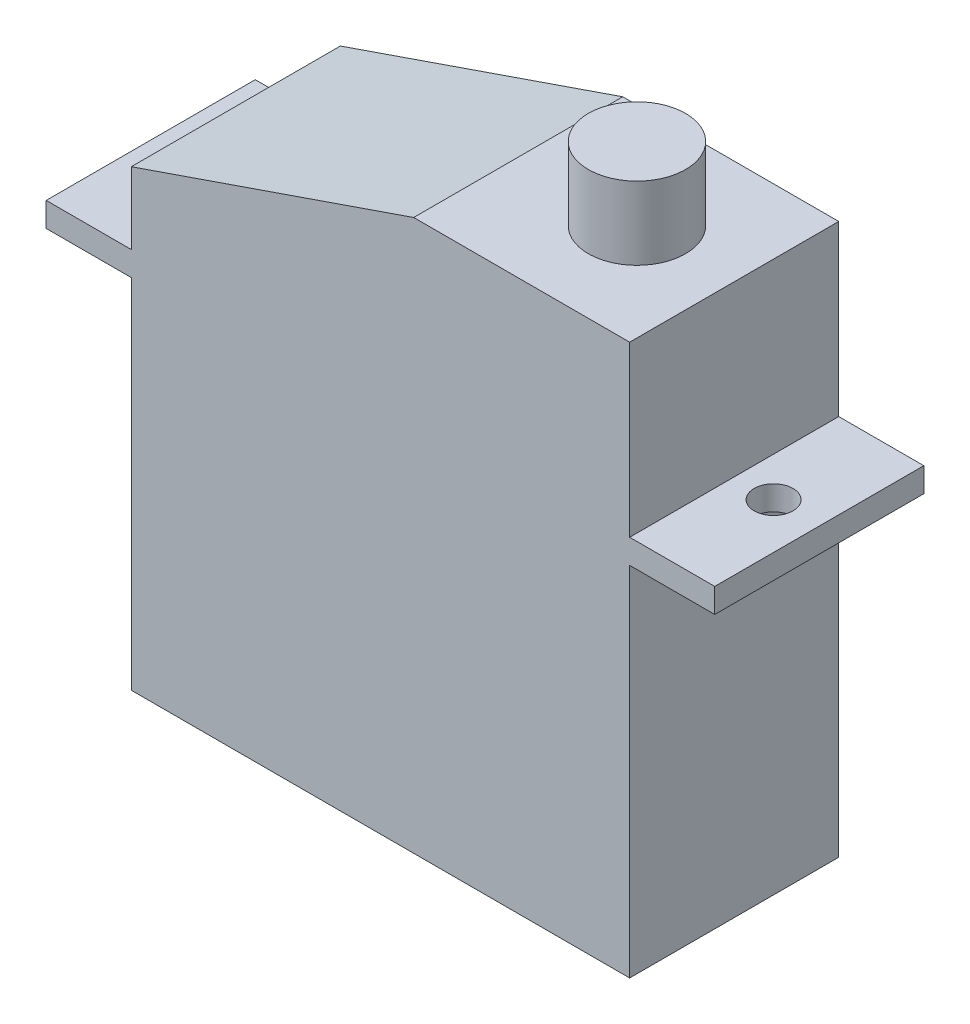
ISO-10303-21;
HEADER;
FILE_DESCRIPTION(('STEP AP214'),'2;1');
FILE_NAME('part.step','',(''),(''),'','','');
FILE_SCHEMA(('AUTOMOTIVE_DESIGN { 1 0 10303 214 1 1 1 1 }'));
ENDSEC;
DATA;
#1=APPLICATION_CONTEXT('core data for automotive mechanical design processes');
#2=APPLICATION_PROTOCOL_DEFINITION('international standard','automotive_design',2000,#1);
#3=PRODUCT_CONTEXT('',#1,'mechanical');
#4=PRODUCT('Part','Part','',(#3));
#5=PRODUCT_RELATED_PRODUCT_CATEGORY('part','',(#4));
#6=PRODUCT_DEFINITION_FORMATION('','',#4);
#7=PRODUCT_DEFINITION_CONTEXT('part definition',#1,'design');
#8=PRODUCT_DEFINITION('design','',#6,#7);
#9=PRODUCT_DEFINITION_SHAPE('','',#8);
#10=(LENGTH_UNIT() NAMED_UNIT(*) SI_UNIT(.MILLI.,.METRE.));
#11=(NAMED_UNIT(*) PLANE_ANGLE_UNIT() SI_UNIT($,.RADIAN.));
#12=(NAMED_UNIT(*) SI_UNIT($,.STERADIAN.) SOLID_ANGLE_UNIT());
#13=UNCERTAINTY_MEASURE_WITH_UNIT(LENGTH_MEASURE(1.E-05),#10,'distance_accuracy_value','');
#14=(GEOMETRIC_REPRESENTATION_CONTEXT(3) GLOBAL_UNCERTAINTY_ASSIGNED_CONTEXT((#13)) GLOBAL_UNIT_ASSIGNED_CONTEXT((#10,
#11,#12)) REPRESENTATION_CONTEXT('',''));
#15=CARTESIAN_POINT('',(0.,0.,0.));
#16=DIRECTION('',(0.,0.,1.));
#17=DIRECTION('',(1.,0.,0.));
#18=AXIS2_PLACEMENT_3D('',#15,#16,#17);
#19=CARTESIAN_POINT('',(20.5,15.2,0.));
#20=DIRECTION('',(-1.,0.,0.));
#21=DIRECTION('',(0.,0.,1.));
#22=AXIS2_PLACEMENT_3D('',#19,#20,#21);
#23=PLANE('',#22);
#24=DIRECTION('',(0.,0.,1.));
#25=VECTOR('',#24,1.);
#26=CARTESIAN_POINT('',(20.5,15.7,-8.6));
#27=LINE('',#26,#25);
#28=CARTESIAN_POINT('',(20.5,15.7,-8.6));
#29=VERTEX_POINT('',#28);
#30=CARTESIAN_POINT('',(20.5,15.7,0.));
#31=VERTEX_POINT('',#30);
#32=EDGE_CURVE('E249',#29,#31,#27,.T.);
#33=ORIENTED_EDGE('',*,*,#32,.F.);
#34=DIRECTION('',(0.,-1.,0.));
#35=VECTOR('',#34,1.);
#36=CARTESIAN_POINT('',(20.5,15.2,-8.6));
#37=LINE('',#36,#35);
#38=CARTESIAN_POINT('',(20.5,22.65,-8.6));
#39=VERTEX_POINT('',#38);
#40=EDGE_CURVE('E159',#39,#29,#37,.T.);
#41=ORIENTED_EDGE('',*,*,#40,.F.);
#42=DIRECTION('',(0.,0.,1.));
#43=VECTOR('',#42,1.);
#44=CARTESIAN_POINT('',(20.5,22.65,-8.6));
#45=LINE('',#44,#43);
#46=CARTESIAN_POINT('',(20.5,22.65,0.));
#47=VERTEX_POINT('',#46);
#48=EDGE_CURVE('E196',#39,#47,#45,.T.);
#49=ORIENTED_EDGE('',*,*,#48,.T.);
#50=DIRECTION('',(0.,-1.,0.));
#51=VECTOR('',#50,1.);
#52=CARTESIAN_POINT('',(20.5,15.2,0.));
#53=LINE('',#52,#51);
#54=EDGE_CURVE('E169',#47,#31,#53,.T.);
#55=ORIENTED_EDGE('',*,*,#54,.T.);
#56=EDGE_LOOP('',(#33,#41,#49,#55));
#57=FACE_BOUND('',#56,.T.);
#58=ADVANCED_FACE('F37',(#57),#23,.F.);
#59=CARTESIAN_POINT('',(0.,15.2,0.));
#60=DIRECTION('',(1.,0.,0.));
#61=DIRECTION('',(0.,0.,-1.));
#62=AXIS2_PLACEMENT_3D('',#59,#60,#61);
#63=PLANE('',#62);
#64=DIRECTION('',(0.,0.,1.));
#65=VECTOR('',#64,1.);
#66=CARTESIAN_POINT('',(0.,14.7,-8.6));
#67=LINE('',#66,#65);
#68=CARTESIAN_POINT('',(0.,14.7,-8.6));
#69=VERTEX_POINT('',#68);
#70=CARTESIAN_POINT('',(0.,14.7,0.));
#71=VERTEX_POINT('',#70);
#72=EDGE_CURVE('E216',#69,#71,#67,.T.);
#73=ORIENTED_EDGE('',*,*,#72,.F.);
#74=DIRECTION('',(0.,-1.,0.));
#75=VECTOR('',#74,1.);
#76=CARTESIAN_POINT('',(0.,15.2,-8.6));
#77=LINE('',#76,#75);
#78=CARTESIAN_POINT('',(0.,0.,-8.6));
#79=VERTEX_POINT('',#78);
#80=EDGE_CURVE('E165',#69,#79,#77,.T.);
#81=ORIENTED_EDGE('',*,*,#80,.T.);
#82=DIRECTION('',(0.,0.,1.));
#83=VECTOR('',#82,1.);
#84=CARTESIAN_POINT('',(0.,0.,0.));
#85=LINE('',#84,#83);
#86=CARTESIAN_POINT('',(0.,0.,0.));
#87=VERTEX_POINT('',#86);
#88=EDGE_CURVE('E218',#79,#87,#85,.T.);
#89=ORIENTED_EDGE('',*,*,#88,.T.);
#90=DIRECTION('',(0.,-1.,0.));
#91=VECTOR('',#90,1.);
#92=CARTESIAN_POINT('',(0.,15.2,0.));
#93=LINE('',#92,#91);
#94=EDGE_CURVE('E172',#71,#87,#93,.T.);
#95=ORIENTED_EDGE('',*,*,#94,.F.);
#96=EDGE_LOOP('',(#73,#81,#89,#95));
#97=FACE_BOUND('',#96,.T.);
#98=ADVANCED_FACE('F229',(#97),#63,.F.);
#99=CARTESIAN_POINT('',(0.,18.65,-8.6));
#100=VERTEX_POINT('',#99);
#101=CARTESIAN_POINT('',(0.,15.7,-8.6));
#102=VERTEX_POINT('',#101);
#103=EDGE_CURVE('E160',#100,#102,#77,.T.);
#104=ORIENTED_EDGE('',*,*,#103,.T.);
#105=DIRECTION('',(0.,0.,1.));
#106=VECTOR('',#105,1.);
#107=CARTESIAN_POINT('',(0.,15.7,-8.6));
#108=LINE('',#107,#106);
#109=CARTESIAN_POINT('',(0.,15.7,0.));
#110=VERTEX_POINT('',#109);
#111=EDGE_CURVE('E204',#102,#110,#108,.T.);
#112=ORIENTED_EDGE('',*,*,#111,.T.);
#113=CARTESIAN_POINT('',(0.,18.65,0.));
#114=VERTEX_POINT('',#113);
#115=EDGE_CURVE('E173',#114,#110,#93,.T.);
#116=ORIENTED_EDGE('',*,*,#115,.F.);
#117=DIRECTION('',(0.,0.,-1.));
#118=VECTOR('',#117,1.);
#119=CARTESIAN_POINT('',(0.,18.65,-8.6));
#120=LINE('',#119,#118);
#121=EDGE_CURVE('E181',#114,#100,#120,.T.);
#122=ORIENTED_EDGE('',*,*,#121,.T.);
#123=EDGE_LOOP('',(#104,#112,#116,#122));
#124=FACE_BOUND('',#123,.T.);
#125=ADVANCED_FACE('F203',(#124),#63,.F.);
#126=CARTESIAN_POINT('',(0.,15.2,0.));
#127=DIRECTION('',(0.,0.,-1.));
#128=DIRECTION('',(-1.,0.,0.));
#129=AXIS2_PLACEMENT_3D('',#126,#127,#128);
#130=PLANE('',#129);
#131=DIRECTION('',(-1.,0.,0.));
#132=VECTOR('',#131,1.);
#133=CARTESIAN_POINT('',(20.5,22.65,0.));
#134=LINE('',#133,#132);
#135=CARTESIAN_POINT('',(11.6168435107033,22.65,0.));
#136=VERTEX_POINT('',#135);
#137=EDGE_CURVE('E197',#47,#136,#134,.T.);
#138=ORIENTED_EDGE('',*,*,#137,.T.);
#139=DIRECTION('',(-0.945518575599317,-0.325568154457158,0.));
#140=VECTOR('',#139,1.);
#141=CARTESIAN_POINT('',(11.6168435107033,22.65,0.));
#142=LINE('',#141,#140);
#143=EDGE_CURVE('E179',#136,#114,#142,.T.);
#144=ORIENTED_EDGE('',*,*,#143,.T.);
#145=ORIENTED_EDGE('',*,*,#115,.T.);
#146=DIRECTION('',(-1.,0.,0.));
#147=VECTOR('',#146,1.);
#148=CARTESIAN_POINT('',(0.,15.7,0.));
#149=LINE('',#148,#147);
#150=CARTESIAN_POINT('',(-3.5,15.7,0.));
#151=VERTEX_POINT('',#150);
#152=EDGE_CURVE('E63',#110,#151,#149,.T.);
#153=ORIENTED_EDGE('',*,*,#152,.T.);
#154=DIRECTION('',(0.,-1.,0.));
#155=VECTOR('',#154,1.);
#156=CARTESIAN_POINT('',(-3.5,15.7,0.));
#157=LINE('',#156,#155);
#158=CARTESIAN_POINT('',(-3.5,14.7,0.));
#159=VERTEX_POINT('',#158);
#160=EDGE_CURVE('E248',#151,#159,#157,.T.);
#161=ORIENTED_EDGE('',*,*,#160,.T.);
#162=DIRECTION('',(1.,0.,0.));
#163=VECTOR('',#162,1.);
#164=CARTESIAN_POINT('',(0.,14.7,0.));
#165=LINE('',#164,#163);
#166=EDGE_CURVE('E238',#159,#71,#165,.T.);
#167=ORIENTED_EDGE('',*,*,#166,.T.);
#168=ORIENTED_EDGE('',*,*,#94,.T.);
#169=DIRECTION('',(1.,0.,0.));
#170=VECTOR('',#169,1.);
#171=CARTESIAN_POINT('',(0.,0.,0.));
#172=LINE('',#171,#170);
#173=CARTESIAN_POINT('',(20.5,0.,0.));
#174=VERTEX_POINT('',#173);
#175=EDGE_CURVE('E221',#87,#174,#172,.T.);
#176=ORIENTED_EDGE('',*,*,#175,.T.);
#177=CARTESIAN_POINT('',(20.5,14.7,0.));
#178=VERTEX_POINT('',#177);
#179=EDGE_CURVE('E163',#178,#174,#53,.T.);
#180=ORIENTED_EDGE('',*,*,#179,.F.);
#181=DIRECTION('',(1.,0.,0.));
#182=VECTOR('',#181,1.);
#183=CARTESIAN_POINT('',(20.5,14.7,0.));
#184=LINE('',#183,#182);
#185=CARTESIAN_POINT('',(24.,14.7,0.));
#186=VERTEX_POINT('',#185);
#187=EDGE_CURVE('E55',#178,#186,#184,.T.);
#188=ORIENTED_EDGE('',*,*,#187,.T.);
#189=DIRECTION('',(0.,1.,0.));
#190=VECTOR('',#189,1.);
#191=CARTESIAN_POINT('',(24.,15.7,0.));
#192=LINE('',#191,#190);
#193=CARTESIAN_POINT('',(24.,15.7,0.));
#194=VERTEX_POINT('',#193);
#195=EDGE_CURVE('E417',#186,#194,#192,.T.);
#196=ORIENTED_EDGE('',*,*,#195,.T.);
#197=DIRECTION('',(-1.,0.,0.));
#198=VECTOR('',#197,1.);
#199=CARTESIAN_POINT('',(20.5,15.7,0.));
#200=LINE('',#199,#198);
#201=EDGE_CURVE('E153',#194,#31,#200,.T.);
#202=ORIENTED_EDGE('',*,*,#201,.T.);
#203=ORIENTED_EDGE('',*,*,#54,.F.);
#204=EDGE_LOOP('',(#138,#144,#145,#153,#161,#167,#168,#176,#180,#188,#196,#202,#203));
#205=FACE_BOUND('',#204,.T.);
#206=ADVANCED_FACE('F201',(#205),#130,.F.);
#207=CARTESIAN_POINT('',(20.5,14.7,-8.6));
#208=VERTEX_POINT('',#207);
#209=CARTESIAN_POINT('',(20.5,0.,-8.6));
#210=VERTEX_POINT('',#209);
#211=EDGE_CURVE('E148',#208,#210,#37,.T.);
#212=ORIENTED_EDGE('',*,*,#211,.F.);
#213=DIRECTION('',(0.,0.,1.));
#214=VECTOR('',#213,1.);
#215=CARTESIAN_POINT('',(20.5,14.7,-8.6));
#216=LINE('',#215,#214);
#217=EDGE_CURVE('E133',#208,#178,#216,.T.);
#218=ORIENTED_EDGE('',*,*,#217,.T.);
#219=ORIENTED_EDGE('',*,*,#179,.T.);
#220=DIRECTION('',(0.,0.,-1.));
#221=VECTOR('',#220,1.);
#222=CARTESIAN_POINT('',(20.5,0.,0.));
#223=LINE('',#222,#221);
#224=EDGE_CURVE('E157',#174,#210,#223,.T.);
#225=ORIENTED_EDGE('',*,*,#224,.T.);
#226=EDGE_LOOP('',(#212,#218,#219,#225));
#227=FACE_BOUND('',#226,.T.);
#228=ADVANCED_FACE('F155',(#227),#23,.F.);
#229=CARTESIAN_POINT('',(0.,15.2,-8.6));
#230=DIRECTION('',(0.,0.,1.));
#231=DIRECTION('',(1.,0.,0.));
#232=AXIS2_PLACEMENT_3D('',#229,#230,#231);
#233=PLANE('',#232);
#234=ORIENTED_EDGE('',*,*,#103,.F.);
#235=DIRECTION('',(0.945518575599317,0.325568154457158,0.));
#236=VECTOR('',#235,1.);
#237=CARTESIAN_POINT('',(11.6168435107033,22.65,-8.6));
#238=LINE('',#237,#236);
#239=CARTESIAN_POINT('',(11.6168435107033,22.65,-8.6));
#240=VERTEX_POINT('',#239);
#241=EDGE_CURVE('E47',#100,#240,#238,.T.);
#242=ORIENTED_EDGE('',*,*,#241,.T.);
#243=DIRECTION('',(-1.,0.,0.));
#244=VECTOR('',#243,1.);
#245=CARTESIAN_POINT('',(20.5,22.65,-8.6));
#246=LINE('',#245,#244);
#247=EDGE_CURVE('E185',#39,#240,#246,.T.);
#248=ORIENTED_EDGE('',*,*,#247,.F.);
#249=ORIENTED_EDGE('',*,*,#40,.T.);
#250=DIRECTION('',(-1.,0.,0.));
#251=VECTOR('',#250,1.);
#252=CARTESIAN_POINT('',(20.5,15.7,-8.6));
#253=LINE('',#252,#251);
#254=CARTESIAN_POINT('',(24.,15.7,-8.6));
#255=VERTEX_POINT('',#254);
#256=EDGE_CURVE('E141',#255,#29,#253,.T.);
#257=ORIENTED_EDGE('',*,*,#256,.F.);
#258=DIRECTION('',(0.,1.,0.));
#259=VECTOR('',#258,1.);
#260=CARTESIAN_POINT('',(24.,15.7,-8.6));
#261=LINE('',#260,#259);
#262=CARTESIAN_POINT('',(24.,14.7,-8.6));
#263=VERTEX_POINT('',#262);
#264=EDGE_CURVE('E152',#263,#255,#261,.T.);
#265=ORIENTED_EDGE('',*,*,#264,.F.);
#266=DIRECTION('',(1.,0.,0.));
#267=VECTOR('',#266,1.);
#268=CARTESIAN_POINT('',(20.5,14.7,-8.6));
#269=LINE('',#268,#267);
#270=EDGE_CURVE('E136',#208,#263,#269,.T.);
#271=ORIENTED_EDGE('',*,*,#270,.F.);
#272=ORIENTED_EDGE('',*,*,#211,.T.);
#273=DIRECTION('',(-1.,0.,0.));
#274=VECTOR('',#273,1.);
#275=CARTESIAN_POINT('',(0.,0.,-8.6));
#276=LINE('',#275,#274);
#277=EDGE_CURVE('E224',#210,#79,#276,.T.);
#278=ORIENTED_EDGE('',*,*,#277,.T.);
#279=ORIENTED_EDGE('',*,*,#80,.F.);
#280=DIRECTION('',(1.,0.,0.));
#281=VECTOR('',#280,1.);
#282=CARTESIAN_POINT('',(0.,14.7,-8.6));
#283=LINE('',#282,#281);
#284=CARTESIAN_POINT('',(-3.5,14.7,-8.6));
#285=VERTEX_POINT('',#284);
#286=EDGE_CURVE('E207',#285,#69,#283,.T.);
#287=ORIENTED_EDGE('',*,*,#286,.F.);
#288=DIRECTION('',(0.,-1.,0.));
#289=VECTOR('',#288,1.);
#290=CARTESIAN_POINT('',(-3.5,15.7,-8.6));
#291=LINE('',#290,#289);
#292=CARTESIAN_POINT('',(-3.5,15.7,-8.6));
#293=VERTEX_POINT('',#292);
#294=EDGE_CURVE('E211',#293,#285,#291,.T.);
#295=ORIENTED_EDGE('',*,*,#294,.F.);
#296=DIRECTION('',(-1.,0.,0.));
#297=VECTOR('',#296,1.);
#298=CARTESIAN_POINT('',(0.,15.7,-8.6));
#299=LINE('',#298,#297);
#300=EDGE_CURVE('E243',#102,#293,#299,.T.);
#301=ORIENTED_EDGE('',*,*,#300,.F.);
#302=EDGE_LOOP('',(#234,#242,#248,#249,#257,#265,#271,#272,#278,#279,#287,#295,#301));
#303=FACE_BOUND('',#302,.T.);
#304=ADVANCED_FACE('F146',(#303),#233,.F.);
#305=CARTESIAN_POINT('',(0.,0.,0.));
#306=DIRECTION('',(0.,-1.,0.));
#307=DIRECTION('',(0.,0.,-1.));
#308=AXIS2_PLACEMENT_3D('',#305,#306,#307);
#309=PLANE('',#308);
#310=ORIENTED_EDGE('',*,*,#88,.F.);
#311=ORIENTED_EDGE('',*,*,#277,.F.);
#312=ORIENTED_EDGE('',*,*,#224,.F.);
#313=ORIENTED_EDGE('',*,*,#175,.F.);
#314=EDGE_LOOP('',(#310,#311,#312,#313));
#315=FACE_BOUND('',#314,.T.);
#316=ADVANCED_FACE('F254',(#315),#309,.T.);
#317=CARTESIAN_POINT('',(20.5,22.65,-8.6));
#318=DIRECTION('',(0.,1.,0.));
#319=DIRECTION('',(-1.,0.,0.));
#320=AXIS2_PLACEMENT_3D('',#317,#318,#319);
#321=PLANE('',#320);
#322=CARTESIAN_POINT('',(16.5,22.65,-4.3));
#323=DIRECTION('',(0.,1.,0.));
#324=DIRECTION('',(-1.,0.,0.));
#325=AXIS2_PLACEMENT_3D('',#322,#323,#324);
#326=CIRCLE('',#325,2.);
#327=CARTESIAN_POINT('',(14.5,22.65,-4.3));
#328=VERTEX_POINT('',#327);
#329=EDGE_CURVE('E11',#328,#328,#326,.T.);
#330=ORIENTED_EDGE('',*,*,#329,.F.);
#331=EDGE_LOOP('',(#330));
#332=FACE_BOUND('',#331,.T.);
#333=ORIENTED_EDGE('',*,*,#247,.T.);
#334=DIRECTION('',(0.,0.,1.));
#335=VECTOR('',#334,1.);
#336=CARTESIAN_POINT('',(11.6168435107033,22.65,0.));
#337=LINE('',#336,#335);
#338=EDGE_CURVE('E176',#240,#136,#337,.T.);
#339=ORIENTED_EDGE('',*,*,#338,.T.);
#340=ORIENTED_EDGE('',*,*,#137,.F.);
#341=ORIENTED_EDGE('',*,*,#48,.F.);
#342=EDGE_LOOP('',(#333,#339,#340,#341));
#343=FACE_BOUND('',#342,.T.);
#344=ADVANCED_FACE('F192',(#332,#343),#321,.T.);
#345=CARTESIAN_POINT('',(11.6168435107033,22.65,-8.6));
#346=DIRECTION('',(-0.325568154457157,0.945518575599316,0.));
#347=DIRECTION('',(0.,0.,-1.));
#348=AXIS2_PLACEMENT_3D('',#345,#346,#347);
#349=PLANE('',#348);
#350=ORIENTED_EDGE('',*,*,#241,.F.);
#351=ORIENTED_EDGE('',*,*,#121,.F.);
#352=ORIENTED_EDGE('',*,*,#143,.F.);
#353=ORIENTED_EDGE('',*,*,#338,.F.);
#354=EDGE_LOOP('',(#350,#351,#352,#353));
#355=FACE_BOUND('',#354,.T.);
#356=ADVANCED_FACE('F40',(#355),#349,.T.);
#357=CARTESIAN_POINT('',(0.,14.7,-8.6));
#358=DIRECTION('',(0.,-1.,0.));
#359=DIRECTION('',(1.,0.,0.));
#360=AXIS2_PLACEMENT_3D('',#357,#358,#359);
#361=PLANE('',#360);
#362=CARTESIAN_POINT('',(-1.62,14.7,-4.3));
#363=DIRECTION('',(0.,-1.,0.));
#364=DIRECTION('',(1.,0.,0.));
#365=AXIS2_PLACEMENT_3D('',#362,#363,#364);
#366=CIRCLE('',#365,0.8);
#367=CARTESIAN_POINT('',(-2.42,14.7,-4.3));
#368=VERTEX_POINT('',#367);
#369=EDGE_CURVE('E411',#368,#368,#366,.T.);
#370=ORIENTED_EDGE('',*,*,#369,.F.);
#371=EDGE_LOOP('',(#370));
#372=FACE_BOUND('',#371,.T.);
#373=ORIENTED_EDGE('',*,*,#166,.F.);
#374=DIRECTION('',(0.,0.,1.));
#375=VECTOR('',#374,1.);
#376=CARTESIAN_POINT('',(-3.5,14.7,-8.6));
#377=LINE('',#376,#375);
#378=EDGE_CURVE('E209',#285,#159,#377,.T.);
#379=ORIENTED_EDGE('',*,*,#378,.F.);
#380=ORIENTED_EDGE('',*,*,#286,.T.);
#381=ORIENTED_EDGE('',*,*,#72,.T.);
#382=EDGE_LOOP('',(#373,#379,#380,#381));
#383=FACE_BOUND('',#382,.T.);
#384=ADVANCED_FACE('F236',(#372,#383),#361,.T.);
#385=CARTESIAN_POINT('',(-3.5,15.7,-8.6));
#386=DIRECTION('',(-1.,0.,0.));
#387=DIRECTION('',(0.,0.,1.));
#388=AXIS2_PLACEMENT_3D('',#385,#386,#387);
#389=PLANE('',#388);
#390=ORIENTED_EDGE('',*,*,#160,.F.);
#391=DIRECTION('',(0.,0.,1.));
#392=VECTOR('',#391,1.);
#393=CARTESIAN_POINT('',(-3.5,15.7,-8.6));
#394=LINE('',#393,#392);
#395=EDGE_CURVE('E206',#293,#151,#394,.T.);
#396=ORIENTED_EDGE('',*,*,#395,.F.);
#397=ORIENTED_EDGE('',*,*,#294,.T.);
#398=ORIENTED_EDGE('',*,*,#378,.T.);
#399=EDGE_LOOP('',(#390,#396,#397,#398));
#400=FACE_BOUND('',#399,.T.);
#401=ADVANCED_FACE('F242',(#400),#389,.T.);
#402=CARTESIAN_POINT('',(0.,15.7,-8.6));
#403=DIRECTION('',(0.,1.,0.));
#404=DIRECTION('',(-1.,0.,0.));
#405=AXIS2_PLACEMENT_3D('',#402,#403,#404);
#406=PLANE('',#405);
#407=CARTESIAN_POINT('',(-1.62,15.7,-4.3));
#408=DIRECTION('',(0.,1.,0.));
#409=DIRECTION('',(-1.,0.,0.));
#410=AXIS2_PLACEMENT_3D('',#407,#408,#409);
#411=CIRCLE('',#410,0.8);
#412=CARTESIAN_POINT('',(-2.42,15.7,-4.3));
#413=VERTEX_POINT('',#412);
#414=EDGE_CURVE('E406',#413,#413,#411,.T.);
#415=ORIENTED_EDGE('',*,*,#414,.F.);
#416=EDGE_LOOP('',(#415));
#417=FACE_BOUND('',#416,.T.);
#418=ORIENTED_EDGE('',*,*,#152,.F.);
#419=ORIENTED_EDGE('',*,*,#111,.F.);
#420=ORIENTED_EDGE('',*,*,#300,.T.);
#421=ORIENTED_EDGE('',*,*,#395,.T.);
#422=EDGE_LOOP('',(#418,#419,#420,#421));
#423=FACE_BOUND('',#422,.T.);
#424=ADVANCED_FACE('F324',(#417,#423),#406,.T.);
#425=CARTESIAN_POINT('',(20.5,15.7,-8.6));
#426=DIRECTION('',(0.,1.,0.));
#427=DIRECTION('',(0.,0.,1.));
#428=AXIS2_PLACEMENT_3D('',#425,#426,#427);
#429=PLANE('',#428);
#430=CARTESIAN_POINT('',(22.12,15.7,-4.3));
#431=DIRECTION('',(0.,1.,0.));
#432=DIRECTION('',(-1.,0.,0.));
#433=AXIS2_PLACEMENT_3D('',#430,#431,#432);
#434=CIRCLE('',#433,0.799999999999999);
#435=CARTESIAN_POINT('',(21.32,15.7,-4.3));
#436=VERTEX_POINT('',#435);
#437=EDGE_CURVE('E403',#436,#436,#434,.T.);
#438=ORIENTED_EDGE('',*,*,#437,.F.);
#439=EDGE_LOOP('',(#438));
#440=FACE_BOUND('',#439,.T.);
#441=ORIENTED_EDGE('',*,*,#201,.F.);
#442=DIRECTION('',(0.,0.,1.));
#443=VECTOR('',#442,1.);
#444=CARTESIAN_POINT('',(24.,15.7,-8.6));
#445=LINE('',#444,#443);
#446=EDGE_CURVE('E423',#255,#194,#445,.T.);
#447=ORIENTED_EDGE('',*,*,#446,.F.);
#448=ORIENTED_EDGE('',*,*,#256,.T.);
#449=ORIENTED_EDGE('',*,*,#32,.T.);
#450=EDGE_LOOP('',(#441,#447,#448,#449));
#451=FACE_BOUND('',#450,.T.);
#452=ADVANCED_FACE('F333',(#440,#451),#429,.T.);
#453=CARTESIAN_POINT('',(24.,15.7,-8.6));
#454=DIRECTION('',(1.,0.,0.));
#455=DIRECTION('',(0.,0.,-1.));
#456=AXIS2_PLACEMENT_3D('',#453,#454,#455);
#457=PLANE('',#456);
#458=ORIENTED_EDGE('',*,*,#195,.F.);
#459=DIRECTION('',(0.,0.,1.));
#460=VECTOR('',#459,1.);
#461=CARTESIAN_POINT('',(24.,14.7,-8.6));
#462=LINE('',#461,#460);
#463=EDGE_CURVE('E140',#263,#186,#462,.T.);
#464=ORIENTED_EDGE('',*,*,#463,.F.);
#465=ORIENTED_EDGE('',*,*,#264,.T.);
#466=ORIENTED_EDGE('',*,*,#446,.T.);
#467=EDGE_LOOP('',(#458,#464,#465,#466));
#468=FACE_BOUND('',#467,.T.);
#469=ADVANCED_FACE('F342',(#468),#457,.T.);
#470=CARTESIAN_POINT('',(20.5,14.7,-8.6));
#471=DIRECTION('',(0.,-1.,0.));
#472=DIRECTION('',(1.,0.,0.));
#473=AXIS2_PLACEMENT_3D('',#470,#471,#472);
#474=PLANE('',#473);
#475=CARTESIAN_POINT('',(22.12,14.7,-4.3));
#476=DIRECTION('',(0.,-1.,0.));
#477=DIRECTION('',(1.,0.,0.));
#478=AXIS2_PLACEMENT_3D('',#475,#476,#477);
#479=CIRCLE('',#478,0.799999999999999);
#480=CARTESIAN_POINT('',(21.32,14.7,-4.3));
#481=VERTEX_POINT('',#480);
#482=EDGE_CURVE('E42',#481,#481,#479,.T.);
#483=ORIENTED_EDGE('',*,*,#482,.F.);
#484=EDGE_LOOP('',(#483));
#485=FACE_BOUND('',#484,.T.);
#486=ORIENTED_EDGE('',*,*,#187,.F.);
#487=ORIENTED_EDGE('',*,*,#217,.F.);
#488=ORIENTED_EDGE('',*,*,#270,.T.);
#489=ORIENTED_EDGE('',*,*,#463,.T.);
#490=EDGE_LOOP('',(#486,#487,#488,#489));
#491=FACE_BOUND('',#490,.T.);
#492=ADVANCED_FACE('F135',(#485,#491),#474,.T.);
#493=CARTESIAN_POINT('',(22.12,7.09999999999995,-4.3));
#494=DIRECTION('',(0.,1.,0.));
#495=DIRECTION('',(-1.,0.,0.));
#496=AXIS2_PLACEMENT_3D('',#493,#494,#495);
#497=CYLINDRICAL_SURFACE('',#496,0.799999999999999);
#498=CARTESIAN_POINT('',(21.32,14.7,-4.3));
#499=CARTESIAN_POINT('',(21.32,14.7104166666667,-4.3));
#500=CARTESIAN_POINT('',(21.32,14.7208333333333,-4.3));
#501=CARTESIAN_POINT('',(21.32,14.7416666666667,-4.3));
#502=CARTESIAN_POINT('',(21.32,14.7520833333333,-4.3));
#503=CARTESIAN_POINT('',(21.32,14.7729166666667,-4.3));
#504=CARTESIAN_POINT('',(21.32,14.7833333333333,-4.3));
#505=CARTESIAN_POINT('',(21.32,14.8041666666667,-4.3));
#506=CARTESIAN_POINT('',(21.32,14.8145833333333,-4.3));
#507=CARTESIAN_POINT('',(21.32,14.8354166666667,-4.3));
#508=CARTESIAN_POINT('',(21.32,14.8458333333333,-4.3));
#509=CARTESIAN_POINT('',(21.32,14.8666666666667,-4.3));
#510=CARTESIAN_POINT('',(21.32,14.8770833333333,-4.3));
#511=CARTESIAN_POINT('',(21.32,14.8979166666667,-4.3));
#512=CARTESIAN_POINT('',(21.32,14.9083333333333,-4.3));
#513=CARTESIAN_POINT('',(21.32,14.9291666666667,-4.3));
#514=CARTESIAN_POINT('',(21.32,14.9395833333333,-4.3));
#515=CARTESIAN_POINT('',(21.32,14.9604166666667,-4.3));
#516=CARTESIAN_POINT('',(21.32,14.9708333333333,-4.3));
#517=CARTESIAN_POINT('',(21.32,14.9916666666667,-4.3));
#518=CARTESIAN_POINT('',(21.32,15.0020833333333,-4.3));
#519=CARTESIAN_POINT('',(21.32,15.0229166666667,-4.3));
#520=CARTESIAN_POINT('',(21.32,15.0333333333333,-4.3));
#521=CARTESIAN_POINT('',(21.32,15.0541666666667,-4.3));
#522=CARTESIAN_POINT('',(21.32,15.0645833333333,-4.3));
#523=CARTESIAN_POINT('',(21.32,15.0854166666666,-4.3));
#524=CARTESIAN_POINT('',(21.32,15.0958333333333,-4.3));
#525=CARTESIAN_POINT('',(21.32,15.1166666666666,-4.3));
#526=CARTESIAN_POINT('',(21.32,15.1270833333333,-4.3));
#527=CARTESIAN_POINT('',(21.32,15.1479166666666,-4.3));
#528=CARTESIAN_POINT('',(21.32,15.1583333333333,-4.3));
#529=CARTESIAN_POINT('',(21.32,15.1791666666666,-4.3));
#530=CARTESIAN_POINT('',(21.32,15.1895833333333,-4.3));
#531=CARTESIAN_POINT('',(21.32,15.2104166666666,-4.3));
#532=CARTESIAN_POINT('',(21.32,15.2208333333333,-4.3));
#533=CARTESIAN_POINT('',(21.32,15.2416666666666,-4.3));
#534=CARTESIAN_POINT('',(21.32,15.2520833333333,-4.3));
#535=CARTESIAN_POINT('',(21.32,15.2729166666666,-4.3));
#536=CARTESIAN_POINT('',(21.32,15.2833333333333,-4.3));
#537=CARTESIAN_POINT('',(21.32,15.3041666666666,-4.3));
#538=CARTESIAN_POINT('',(21.32,15.3145833333333,-4.3));
#539=CARTESIAN_POINT('',(21.32,15.3354166666666,-4.3));
#540=CARTESIAN_POINT('',(21.32,15.3458333333333,-4.3));
#541=CARTESIAN_POINT('',(21.32,15.3666666666666,-4.3));
#542=CARTESIAN_POINT('',(21.32,15.3770833333333,-4.3));
#543=CARTESIAN_POINT('',(21.32,15.3979166666666,-4.3));
#544=CARTESIAN_POINT('',(21.32,15.4083333333333,-4.3));
#545=CARTESIAN_POINT('',(21.32,15.4291666666666,-4.3));
#546=CARTESIAN_POINT('',(21.32,15.4395833333333,-4.3));
#547=CARTESIAN_POINT('',(21.32,15.4604166666666,-4.3));
#548=CARTESIAN_POINT('',(21.32,15.4708333333333,-4.3));
#549=CARTESIAN_POINT('',(21.32,15.4916666666666,-4.3));
#550=CARTESIAN_POINT('',(21.32,15.5020833333333,-4.3));
#551=CARTESIAN_POINT('',(21.32,15.5229166666666,-4.3));
#552=CARTESIAN_POINT('',(21.32,15.5333333333333,-4.3));
#553=CARTESIAN_POINT('',(21.32,15.5541666666666,-4.3));
#554=CARTESIAN_POINT('',(21.32,15.5645833333333,-4.3));
#555=CARTESIAN_POINT('',(21.32,15.5854166666666,-4.3));
#556=CARTESIAN_POINT('',(21.32,15.5958333333333,-4.3));
#557=CARTESIAN_POINT('',(21.32,15.6166666666666,-4.3));
#558=CARTESIAN_POINT('',(21.32,15.6270833333333,-4.3));
#559=CARTESIAN_POINT('',(21.32,15.6479166666666,-4.3));
#560=CARTESIAN_POINT('',(21.32,15.6583333333333,-4.3));
#561=CARTESIAN_POINT('',(21.32,15.6791666666666,-4.3));
#562=CARTESIAN_POINT('',(21.32,15.6895833333333,-4.3));
#563=CARTESIAN_POINT('',(21.32,15.7,-4.3));
#564=B_SPLINE_CURVE_WITH_KNOTS('',3,(#498,#499,#500,#501,#502,#503,#504,#505,#506,#507,#508,
#509,#510,#511,#512,#513,#514,#515,#516,#517,#518,#519,#520,#521,#522,#523,#524,#525,#526,#527,
#528,#529,#530,#531,#532,#533,#534,#535,#536,#537,#538,#539,#540,#541,#542,#543,#544,#545,#546,
#547,#548,#549,#550,#551,#552,#553,#554,#555,#556,#557,#558,#559,#560,#561,#562,#563),
.UNSPECIFIED.,.F.,.F.,(4,2,2,2,2,2,2,2,2,2,2,2,2,2,2,2,2,2,2,2,2,2,2,2,2,2,2,2,2,2,2,2,4),(0.,
0.03125,0.0624999999999966,0.0937499999999966,0.124999999999995,0.156249999999993,
0.187499999999993,0.21874999999999,0.249999999999988,0.281249999999986,0.312499999999985,
0.343749999999983,0.374999999999983,0.406249999999981,0.43749999999998,0.468749999999978,
0.499999999999976,0.531249999999974,0.562499999999973,0.593749999999971,0.624999999999969,
0.656249999999969,0.687499999999968,0.718749999999966,0.749999999999964,0.781249999999962,
0.812499999999961,0.843749999999959,0.874999999999959,0.906249999999957,0.937499999999956,
0.968749999999952,0.999999999999952),.UNSPECIFIED.);
#565=EDGE_CURVE('BSEAM358',#481,#436,#564,.T.);
#566=ORIENTED_EDGE('',*,*,#482,.T.);
#567=ORIENTED_EDGE('',*,*,#437,.T.);
#568=ORIENTED_EDGE('',*,*,#565,.T.);
#569=ORIENTED_EDGE('',*,*,#565,.F.);
#570=EDGE_LOOP('',(#566,#568,#567,#569));
#571=FACE_BOUND('',#570,.T.);
#572=ADVANCED_FACE('F358',(#571),#497,.F.);
#573=CARTESIAN_POINT('',(-1.62000000000002,7.1,-4.3));
#574=DIRECTION('',(0.,1.,0.));
#575=DIRECTION('',(-1.,0.,0.));
#576=AXIS2_PLACEMENT_3D('',#573,#574,#575);
#577=CYLINDRICAL_SURFACE('',#576,0.8);
#578=CARTESIAN_POINT('',(-2.42,14.7,-4.3));
#579=CARTESIAN_POINT('',(-2.42,14.7104166666667,-4.3));
#580=CARTESIAN_POINT('',(-2.42,14.7208333333333,-4.3));
#581=CARTESIAN_POINT('',(-2.42,14.7416666666667,-4.3));
#582=CARTESIAN_POINT('',(-2.42,14.7520833333333,-4.3));
#583=CARTESIAN_POINT('',(-2.42,14.7729166666667,-4.3));
#584=CARTESIAN_POINT('',(-2.42,14.7833333333333,-4.3));
#585=CARTESIAN_POINT('',(-2.42,14.8041666666667,-4.3));
#586=CARTESIAN_POINT('',(-2.42,14.8145833333333,-4.3));
#587=CARTESIAN_POINT('',(-2.42,14.8354166666667,-4.3));
#588=CARTESIAN_POINT('',(-2.42,14.8458333333333,-4.3));
#589=CARTESIAN_POINT('',(-2.42,14.8666666666667,-4.3));
#590=CARTESIAN_POINT('',(-2.42,14.8770833333333,-4.3));
#591=CARTESIAN_POINT('',(-2.42,14.8979166666667,-4.3));
#592=CARTESIAN_POINT('',(-2.42,14.9083333333333,-4.3));
#593=CARTESIAN_POINT('',(-2.42,14.9291666666667,-4.3));
#594=CARTESIAN_POINT('',(-2.42,14.9395833333333,-4.3));
#595=CARTESIAN_POINT('',(-2.42,14.9604166666667,-4.3));
#596=CARTESIAN_POINT('',(-2.42,14.9708333333333,-4.3));
#597=CARTESIAN_POINT('',(-2.42,14.9916666666667,-4.3));
#598=CARTESIAN_POINT('',(-2.42,15.0020833333333,-4.3));
#599=CARTESIAN_POINT('',(-2.42,15.0229166666667,-4.3));
#600=CARTESIAN_POINT('',(-2.42,15.0333333333333,-4.3));
#601=CARTESIAN_POINT('',(-2.42,15.0541666666667,-4.3));
#602=CARTESIAN_POINT('',(-2.42,15.0645833333333,-4.3));
#603=CARTESIAN_POINT('',(-2.42,15.0854166666667,-4.3));
#604=CARTESIAN_POINT('',(-2.42,15.0958333333333,-4.3));
#605=CARTESIAN_POINT('',(-2.42,15.1166666666667,-4.3));
#606=CARTESIAN_POINT('',(-2.42,15.1270833333333,-4.3));
#607=CARTESIAN_POINT('',(-2.42,15.1479166666667,-4.3));
#608=CARTESIAN_POINT('',(-2.42,15.1583333333333,-4.3));
#609=CARTESIAN_POINT('',(-2.42,15.1791666666667,-4.3));
#610=CARTESIAN_POINT('',(-2.42,15.1895833333333,-4.3));
#611=CARTESIAN_POINT('',(-2.42,15.2104166666667,-4.3));
#612=CARTESIAN_POINT('',(-2.42,15.2208333333333,-4.3));
#613=CARTESIAN_POINT('',(-2.42,15.2416666666667,-4.3));
#614=CARTESIAN_POINT('',(-2.42,15.2520833333333,-4.3));
#615=CARTESIAN_POINT('',(-2.42,15.2729166666667,-4.3));
#616=CARTESIAN_POINT('',(-2.42,15.2833333333333,-4.3));
#617=CARTESIAN_POINT('',(-2.42,15.3041666666667,-4.3));
#618=CARTESIAN_POINT('',(-2.42,15.3145833333333,-4.3));
#619=CARTESIAN_POINT('',(-2.42,15.3354166666667,-4.3));
#620=CARTESIAN_POINT('',(-2.42,15.3458333333333,-4.3));
#621=CARTESIAN_POINT('',(-2.42,15.3666666666667,-4.3));
#622=CARTESIAN_POINT('',(-2.42,15.3770833333333,-4.3));
#623=CARTESIAN_POINT('',(-2.42,15.3979166666667,-4.3));
#624=CARTESIAN_POINT('',(-2.42,15.4083333333333,-4.3));
#625=CARTESIAN_POINT('',(-2.42,15.4291666666667,-4.3));
#626=CARTESIAN_POINT('',(-2.42,15.4395833333333,-4.3));
#627=CARTESIAN_POINT('',(-2.42,15.4604166666667,-4.3));
#628=CARTESIAN_POINT('',(-2.42,15.4708333333333,-4.3));
#629=CARTESIAN_POINT('',(-2.42,15.4916666666667,-4.3));
#630=CARTESIAN_POINT('',(-2.42,15.5020833333333,-4.3));
#631=CARTESIAN_POINT('',(-2.42,15.5229166666667,-4.3));
#632=CARTESIAN_POINT('',(-2.42,15.5333333333333,-4.3));
#633=CARTESIAN_POINT('',(-2.42,15.5541666666667,-4.3));
#634=CARTESIAN_POINT('',(-2.42,15.5645833333333,-4.3));
#635=CARTESIAN_POINT('',(-2.42,15.5854166666667,-4.3));
#636=CARTESIAN_POINT('',(-2.42,15.5958333333333,-4.3));
#637=CARTESIAN_POINT('',(-2.42,15.6166666666667,-4.3));
#638=CARTESIAN_POINT('',(-2.42,15.6270833333333,-4.3));
#639=CARTESIAN_POINT('',(-2.42,15.6479166666667,-4.3));
#640=CARTESIAN_POINT('',(-2.42,15.6583333333333,-4.3));
#641=CARTESIAN_POINT('',(-2.42,15.6791666666667,-4.3));
#642=CARTESIAN_POINT('',(-2.42,15.6895833333333,-4.3));
#643=CARTESIAN_POINT('',(-2.42,15.7,-4.3));
#644=B_SPLINE_CURVE_WITH_KNOTS('',3,(#578,#579,#580,#581,#582,#583,#584,#585,#586,#587,#588,
#589,#590,#591,#592,#593,#594,#595,#596,#597,#598,#599,#600,#601,#602,#603,#604,#605,#606,#607,
#608,#609,#610,#611,#612,#613,#614,#615,#616,#617,#618,#619,#620,#621,#622,#623,#624,#625,#626,
#627,#628,#629,#630,#631,#632,#633,#634,#635,#636,#637,#638,#639,#640,#641,#642,#643),
.UNSPECIFIED.,.F.,.F.,(4,2,2,2,2,2,2,2,2,2,2,2,2,2,2,2,2,2,2,2,2,2,2,2,2,2,2,2,2,2,2,2,4),(0.,
0.03125,0.0625000000000001,0.0937500000000001,0.125,0.15625,0.1875,0.218749999999998,
0.249999999999999,0.281249999999999,0.312499999999999,0.343749999999999,0.374999999999999,
0.406249999999999,0.437499999999999,0.468749999999999,0.499999999999997,0.531249999999997,
0.562499999999997,0.593749999999997,0.624999999999997,0.656249999999997,0.687499999999997,
0.718749999999997,0.749999999999997,0.781249999999997,0.812499999999997,0.843749999999997,
0.874999999999997,0.906249999999997,0.937499999999997,0.968749999999997,0.999999999999997),.UNSPECIFIED.);
#645=EDGE_CURVE('BSEAM367',#368,#413,#644,.T.);
#646=ORIENTED_EDGE('',*,*,#369,.T.);
#647=ORIENTED_EDGE('',*,*,#414,.T.);
#648=ORIENTED_EDGE('',*,*,#645,.T.);
#649=ORIENTED_EDGE('',*,*,#645,.F.);
#650=EDGE_LOOP('',(#646,#648,#647,#649));
#651=FACE_BOUND('',#650,.T.);
#652=ADVANCED_FACE('F367',(#651),#577,.F.);
#653=CARTESIAN_POINT('',(16.5,25.65,-4.3));
#654=DIRECTION('',(0.,-1.,0.));
#655=DIRECTION('',(1.,0.,0.));
#656=AXIS2_PLACEMENT_3D('',#653,#654,#655);
#657=CYLINDRICAL_SURFACE('',#656,2.);
#658=CARTESIAN_POINT('',(16.5,25.65,-4.3));
#659=DIRECTION('',(0.,1.,0.));
#660=DIRECTION('',(-1.,0.,0.));
#661=AXIS2_PLACEMENT_3D('',#658,#659,#660);
#662=CIRCLE('',#661,2.);
#663=CARTESIAN_POINT('',(14.5,25.65,-4.3));
#664=VERTEX_POINT('',#663);
#665=EDGE_CURVE('E402',#664,#664,#662,.T.);
#666=ORIENTED_EDGE('',*,*,#665,.F.);
#667=EDGE_LOOP('',(#666));
#668=FACE_BOUND('',#667,.T.);
#669=ORIENTED_EDGE('',*,*,#329,.T.);
#670=EDGE_LOOP('',(#669));
#671=FACE_BOUND('',#670,.T.);
#672=ADVANCED_FACE('F376',(#668,#671),#657,.T.);
#673=CARTESIAN_POINT('',(16.5,25.65,-4.3));
#674=DIRECTION('',(0.,1.,0.));
#675=DIRECTION('',(-1.,0.,0.));
#676=AXIS2_PLACEMENT_3D('',#673,#674,#675);
#677=PLANE('',#676);
#678=ORIENTED_EDGE('',*,*,#665,.T.);
#679=EDGE_LOOP('',(#678));
#680=FACE_BOUND('',#679,.T.);
#681=ADVANCED_FACE('F385',(#680),#677,.T.);
#682=CLOSED_SHELL('',(#58,#98,#125,#206,#228,#304,#316,#344,#356,#384,#401,#424,#452,#469,#492,
#572,#652,#672,#681));
#683=MANIFOLD_SOLID_BREP('B2',#682);
#684=ADVANCED_BREP_SHAPE_REPRESENTATION('',(#18,#683),#14);
#685=SHAPE_DEFINITION_REPRESENTATION(#9,#684);
ENDSEC;
END-ISO-10303-21;
